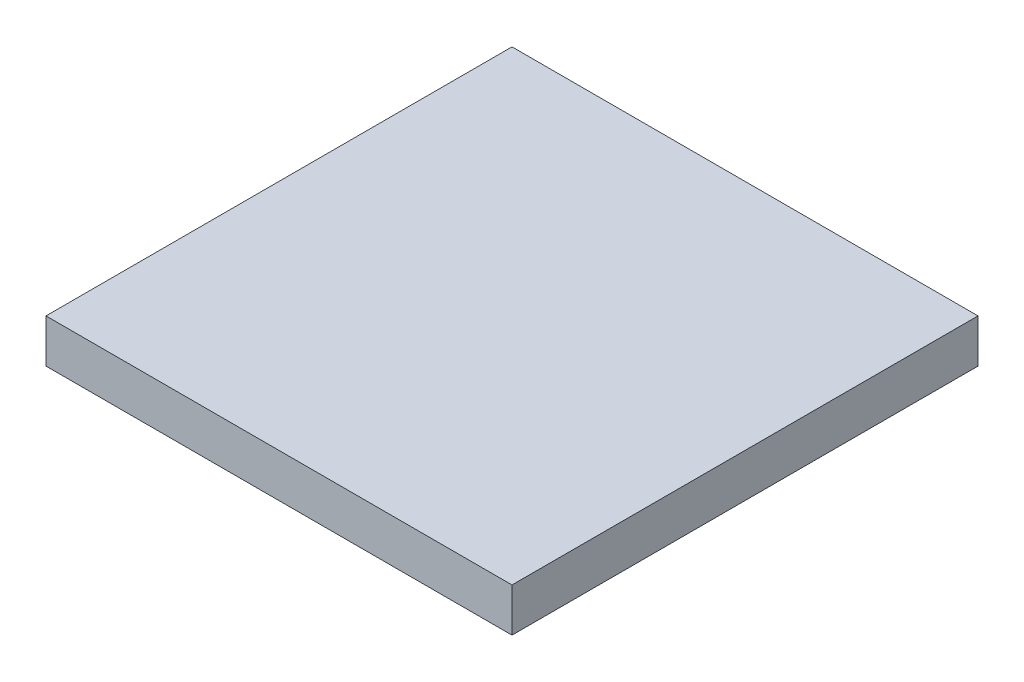
ISO-10303-21;
HEADER;
FILE_DESCRIPTION(('STEP AP214'),'2;1');
FILE_NAME('part.step','',(''),(''),'','','');
FILE_SCHEMA(('AUTOMOTIVE_DESIGN { 1 0 10303 214 1 1 1 1 }'));
ENDSEC;
DATA;
#1=APPLICATION_CONTEXT('core data for automotive mechanical design processes');
#2=APPLICATION_PROTOCOL_DEFINITION('international standard','automotive_design',2000,#1);
#3=PRODUCT_CONTEXT('',#1,'mechanical');
#4=PRODUCT('Part','Part','',(#3));
#5=PRODUCT_RELATED_PRODUCT_CATEGORY('part','',(#4));
#6=PRODUCT_DEFINITION_FORMATION('','',#4);
#7=PRODUCT_DEFINITION_CONTEXT('part definition',#1,'design');
#8=PRODUCT_DEFINITION('design','',#6,#7);
#9=PRODUCT_DEFINITION_SHAPE('','',#8);
#10=(LENGTH_UNIT() NAMED_UNIT(*) SI_UNIT(.MILLI.,.METRE.));
#11=(NAMED_UNIT(*) PLANE_ANGLE_UNIT() SI_UNIT($,.RADIAN.));
#12=(NAMED_UNIT(*) SI_UNIT($,.STERADIAN.) SOLID_ANGLE_UNIT());
#13=UNCERTAINTY_MEASURE_WITH_UNIT(LENGTH_MEASURE(1.E-05),#10,'distance_accuracy_value','');
#14=(GEOMETRIC_REPRESENTATION_CONTEXT(3) GLOBAL_UNCERTAINTY_ASSIGNED_CONTEXT((#13)) GLOBAL_UNIT_ASSIGNED_CONTEXT((#10,
#11,#12)) REPRESENTATION_CONTEXT('',''));
#15=CARTESIAN_POINT('',(0.,0.,0.));
#16=DIRECTION('',(0.,0.,1.));
#17=DIRECTION('',(1.,0.,0.));
#18=AXIS2_PLACEMENT_3D('',#15,#16,#17);
#19=CARTESIAN_POINT('',(0.,0.,0.));
#20=DIRECTION('',(0.,-1.,0.));
#21=DIRECTION('',(0.,0.,-1.));
#22=AXIS2_PLACEMENT_3D('',#19,#20,#21);
#23=PLANE('',#22);
#24=DIRECTION('',(0.,0.,-1.));
#25=VECTOR('',#24,1.);
#26=CARTESIAN_POINT('',(-38.1,0.,38.1));
#27=LINE('',#26,#25);
#28=CARTESIAN_POINT('',(-38.1,0.,38.1));
#29=VERTEX_POINT('',#28);
#30=CARTESIAN_POINT('',(-38.1,0.,-38.1));
#31=VERTEX_POINT('',#30);
#32=EDGE_CURVE('E57',#29,#31,#27,.T.);
#33=ORIENTED_EDGE('',*,*,#32,.T.);
#34=DIRECTION('',(1.,0.,0.));
#35=VECTOR('',#34,1.);
#36=CARTESIAN_POINT('',(-38.1,0.,-38.1));
#37=LINE('',#36,#35);
#38=CARTESIAN_POINT('',(38.1,0.,-38.1));
#39=VERTEX_POINT('',#38);
#40=EDGE_CURVE('E80',#31,#39,#37,.T.);
#41=ORIENTED_EDGE('',*,*,#40,.T.);
#42=DIRECTION('',(0.,0.,1.));
#43=VECTOR('',#42,1.);
#44=CARTESIAN_POINT('',(38.1,0.,38.1));
#45=LINE('',#44,#43);
#46=CARTESIAN_POINT('',(38.1,0.,38.1));
#47=VERTEX_POINT('',#46);
#48=EDGE_CURVE('E60',#39,#47,#45,.T.);
#49=ORIENTED_EDGE('',*,*,#48,.T.);
#50=DIRECTION('',(-1.,0.,0.));
#51=VECTOR('',#50,1.);
#52=CARTESIAN_POINT('',(-38.1,0.,38.1));
#53=LINE('',#52,#51);
#54=EDGE_CURVE('E19',#47,#29,#53,.T.);
#55=ORIENTED_EDGE('',*,*,#54,.T.);
#56=EDGE_LOOP('',(#33,#41,#49,#55));
#57=FACE_BOUND('',#56,.T.);
#58=ADVANCED_FACE('F16',(#57),#23,.T.);
#59=CARTESIAN_POINT('',(-38.1,7.112,38.1));
#60=DIRECTION('',(0.,0.,-1.));
#61=DIRECTION('',(-1.,0.,0.));
#62=AXIS2_PLACEMENT_3D('',#59,#60,#61);
#63=PLANE('',#62);
#64=DIRECTION('',(0.,1.,0.));
#65=VECTOR('',#64,1.);
#66=CARTESIAN_POINT('',(38.1,7.112,38.1));
#67=LINE('',#66,#65);
#68=CARTESIAN_POINT('',(38.1,7.112,38.1));
#69=VERTEX_POINT('',#68);
#70=EDGE_CURVE('E83',#47,#69,#67,.T.);
#71=ORIENTED_EDGE('',*,*,#70,.T.);
#72=DIRECTION('',(1.,0.,0.));
#73=VECTOR('',#72,1.);
#74=CARTESIAN_POINT('',(0.,7.112,38.1));
#75=LINE('',#74,#73);
#76=CARTESIAN_POINT('',(-38.1,7.112,38.1));
#77=VERTEX_POINT('',#76);
#78=EDGE_CURVE('E77',#69,#77,#75,.F.);
#79=ORIENTED_EDGE('',*,*,#78,.T.);
#80=DIRECTION('',(0.,1.,0.));
#81=VECTOR('',#80,1.);
#82=CARTESIAN_POINT('',(-38.1,7.112,38.1));
#83=LINE('',#82,#81);
#84=EDGE_CURVE('E66',#77,#29,#83,.F.);
#85=ORIENTED_EDGE('',*,*,#84,.T.);
#86=ORIENTED_EDGE('',*,*,#54,.F.);
#87=EDGE_LOOP('',(#71,#79,#85,#86));
#88=FACE_BOUND('',#87,.T.);
#89=ADVANCED_FACE('F76',(#88),#63,.F.);
#90=CARTESIAN_POINT('',(-38.1,7.112,38.1));
#91=DIRECTION('',(1.,0.,0.));
#92=DIRECTION('',(0.,0.,-1.));
#93=AXIS2_PLACEMENT_3D('',#90,#91,#92);
#94=PLANE('',#93);
#95=ORIENTED_EDGE('',*,*,#84,.F.);
#96=DIRECTION('',(0.,0.,-1.));
#97=VECTOR('',#96,1.);
#98=CARTESIAN_POINT('',(-38.1,7.112,0.));
#99=LINE('',#98,#97);
#100=CARTESIAN_POINT('',(-38.1,7.112,-38.1));
#101=VERTEX_POINT('',#100);
#102=EDGE_CURVE('E91',#77,#101,#99,.T.);
#103=ORIENTED_EDGE('',*,*,#102,.T.);
#104=DIRECTION('',(0.,1.,0.));
#105=VECTOR('',#104,1.);
#106=CARTESIAN_POINT('',(-38.1,7.112,-38.1));
#107=LINE('',#106,#105);
#108=EDGE_CURVE('E72',#101,#31,#107,.F.);
#109=ORIENTED_EDGE('',*,*,#108,.T.);
#110=ORIENTED_EDGE('',*,*,#32,.F.);
#111=EDGE_LOOP('',(#95,#103,#109,#110));
#112=FACE_BOUND('',#111,.T.);
#113=ADVANCED_FACE('F69',(#112),#94,.F.);
#114=CARTESIAN_POINT('',(-38.1,7.112,-38.1));
#115=DIRECTION('',(0.,0.,1.));
#116=DIRECTION('',(1.,0.,0.));
#117=AXIS2_PLACEMENT_3D('',#114,#115,#116);
#118=PLANE('',#117);
#119=ORIENTED_EDGE('',*,*,#108,.F.);
#120=DIRECTION('',(1.,0.,0.));
#121=VECTOR('',#120,1.);
#122=CARTESIAN_POINT('',(0.,7.112,-38.1));
#123=LINE('',#122,#121);
#124=CARTESIAN_POINT('',(38.1,7.112,-38.1));
#125=VERTEX_POINT('',#124);
#126=EDGE_CURVE('E26',#101,#125,#123,.T.);
#127=ORIENTED_EDGE('',*,*,#126,.T.);
#128=DIRECTION('',(0.,1.,0.));
#129=VECTOR('',#128,1.);
#130=CARTESIAN_POINT('',(38.1,7.112,-38.1));
#131=LINE('',#130,#129);
#132=EDGE_CURVE('E34',#125,#39,#131,.F.);
#133=ORIENTED_EDGE('',*,*,#132,.T.);
#134=ORIENTED_EDGE('',*,*,#40,.F.);
#135=EDGE_LOOP('',(#119,#127,#133,#134));
#136=FACE_BOUND('',#135,.T.);
#137=ADVANCED_FACE('F99',(#136),#118,.F.);
#138=CARTESIAN_POINT('',(38.1,7.112,38.1));
#139=DIRECTION('',(-1.,0.,0.));
#140=DIRECTION('',(0.,0.,1.));
#141=AXIS2_PLACEMENT_3D('',#138,#139,#140);
#142=PLANE('',#141);
#143=ORIENTED_EDGE('',*,*,#132,.F.);
#144=DIRECTION('',(0.,0.,-1.));
#145=VECTOR('',#144,1.);
#146=CARTESIAN_POINT('',(38.1,7.112,0.));
#147=LINE('',#146,#145);
#148=EDGE_CURVE('E11',#125,#69,#147,.F.);
#149=ORIENTED_EDGE('',*,*,#148,.T.);
#150=ORIENTED_EDGE('',*,*,#70,.F.);
#151=ORIENTED_EDGE('',*,*,#48,.F.);
#152=EDGE_LOOP('',(#143,#149,#150,#151));
#153=FACE_BOUND('',#152,.T.);
#154=ADVANCED_FACE('F102',(#153),#142,.F.);
#155=CARTESIAN_POINT('',(0.,7.112,0.));
#156=DIRECTION('',(0.,-1.,0.));
#157=DIRECTION('',(0.,0.,-1.));
#158=AXIS2_PLACEMENT_3D('',#155,#156,#157);
#159=PLANE('',#158);
#160=ORIENTED_EDGE('',*,*,#126,.F.);
#161=ORIENTED_EDGE('',*,*,#102,.F.);
#162=ORIENTED_EDGE('',*,*,#78,.F.);
#163=ORIENTED_EDGE('',*,*,#148,.F.);
#164=EDGE_LOOP('',(#160,#161,#162,#163));
#165=FACE_BOUND('',#164,.T.);
#166=ADVANCED_FACE('F101',(#165),#159,.F.);
#167=CLOSED_SHELL('',(#58,#89,#113,#137,#154,#166));
#168=MANIFOLD_SOLID_BREP('B1',#167);
#169=ADVANCED_BREP_SHAPE_REPRESENTATION('',(#18,#168),#14);
#170=SHAPE_DEFINITION_REPRESENTATION(#9,#169);
ENDSEC;
END-ISO-10303-21;
